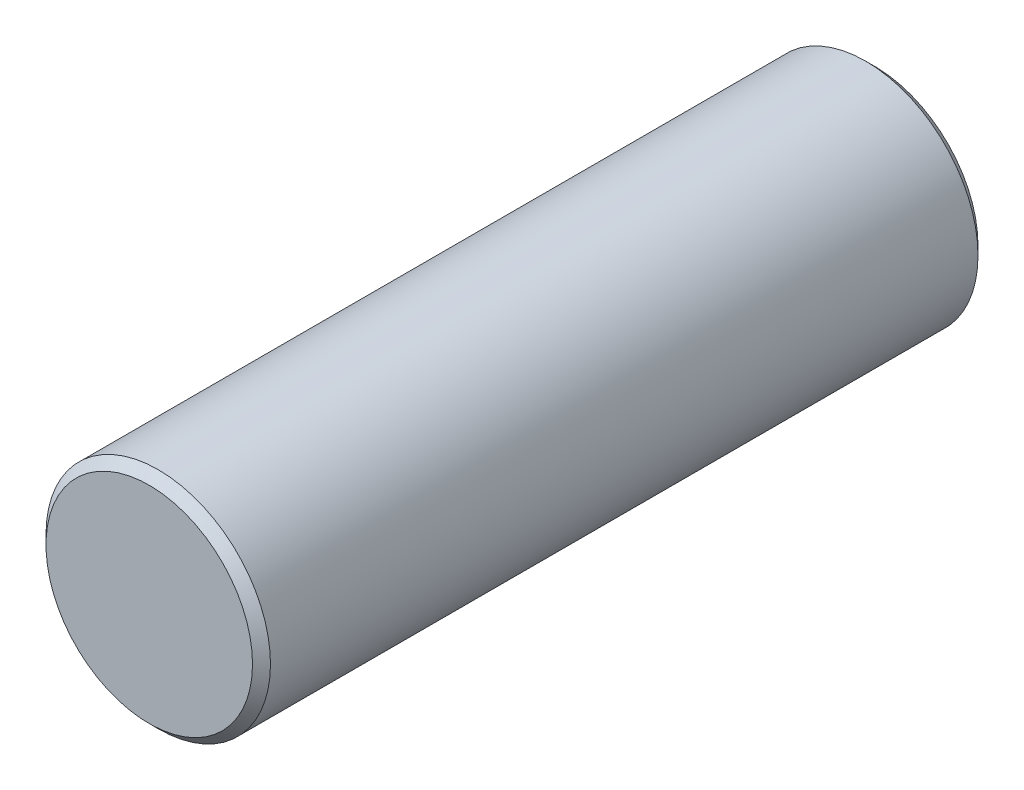
ISO-10303-21;
HEADER;
FILE_DESCRIPTION(('STEP AP214'),'2;1');
FILE_NAME('part.step','',(''),(''),'','','');
FILE_SCHEMA(('AUTOMOTIVE_DESIGN { 1 0 10303 214 1 1 1 1 }'));
ENDSEC;
DATA;
#1=APPLICATION_CONTEXT('core data for automotive mechanical design processes');
#2=APPLICATION_PROTOCOL_DEFINITION('international standard','automotive_design',2000,#1);
#3=PRODUCT_CONTEXT('',#1,'mechanical');
#4=PRODUCT('Part','Part','',(#3));
#5=PRODUCT_RELATED_PRODUCT_CATEGORY('part','',(#4));
#6=PRODUCT_DEFINITION_FORMATION('','',#4);
#7=PRODUCT_DEFINITION_CONTEXT('part definition',#1,'design');
#8=PRODUCT_DEFINITION('design','',#6,#7);
#9=PRODUCT_DEFINITION_SHAPE('','',#8);
#10=(LENGTH_UNIT() NAMED_UNIT(*) SI_UNIT(.MILLI.,.METRE.));
#11=(NAMED_UNIT(*) PLANE_ANGLE_UNIT() SI_UNIT($,.RADIAN.));
#12=(NAMED_UNIT(*) SI_UNIT($,.STERADIAN.) SOLID_ANGLE_UNIT());
#13=UNCERTAINTY_MEASURE_WITH_UNIT(LENGTH_MEASURE(1.E-05),#10,'distance_accuracy_value','');
#14=(GEOMETRIC_REPRESENTATION_CONTEXT(3) GLOBAL_UNCERTAINTY_ASSIGNED_CONTEXT((#13)) GLOBAL_UNIT_ASSIGNED_CONTEXT((#10,
#11,#12)) REPRESENTATION_CONTEXT('',''));
#15=CARTESIAN_POINT('',(0.,0.,0.));
#16=DIRECTION('',(0.,0.,1.));
#17=DIRECTION('',(1.,0.,0.));
#18=AXIS2_PLACEMENT_3D('',#15,#16,#17);
#19=CARTESIAN_POINT('',(0.,0.,8.08));
#20=DIRECTION('',(0.,0.,-1.));
#21=DIRECTION('',(-1.,0.,0.));
#22=AXIS2_PLACEMENT_3D('',#19,#20,#21);
#23=CYLINDRICAL_SURFACE('',#22,2.5);
#24=CARTESIAN_POINT('',(0.,0.,-7.87999999999999));
#25=DIRECTION('',(0.,0.,1.));
#26=DIRECTION('',(1.,0.,0.));
#27=AXIS2_PLACEMENT_3D('',#24,#25,#26);
#28=CIRCLE('',#27,2.5);
#29=CARTESIAN_POINT('',(2.5,0.,-7.87999999999999));
#30=VERTEX_POINT('',#29);
#31=EDGE_CURVE('E49',#30,#30,#28,.T.);
#32=ORIENTED_EDGE('',*,*,#31,.T.);
#33=EDGE_LOOP('',(#32));
#34=FACE_BOUND('',#33,.T.);
#35=CARTESIAN_POINT('',(0.,0.,7.88));
#36=DIRECTION('',(0.,0.,1.));
#37=DIRECTION('',(1.,0.,0.));
#38=AXIS2_PLACEMENT_3D('',#35,#36,#37);
#39=CIRCLE('',#38,2.5);
#40=CARTESIAN_POINT('',(2.5,0.,7.88));
#41=VERTEX_POINT('',#40);
#42=EDGE_CURVE('E53',#41,#41,#39,.F.);
#43=ORIENTED_EDGE('',*,*,#42,.T.);
#44=EDGE_LOOP('',(#43));
#45=FACE_BOUND('',#44,.T.);
#46=ADVANCED_FACE('F37',(#34,#45),#23,.T.);
#47=CARTESIAN_POINT('',(0.,0.,8.08));
#48=DIRECTION('',(0.,0.,1.));
#49=DIRECTION('',(1.,0.,0.));
#50=AXIS2_PLACEMENT_3D('',#47,#48,#49);
#51=PLANE('',#50);
#52=CARTESIAN_POINT('',(0.,0.,8.08));
#53=DIRECTION('',(0.,0.,1.));
#54=DIRECTION('',(1.,0.,0.));
#55=AXIS2_PLACEMENT_3D('',#52,#53,#54);
#56=CIRCLE('',#55,2.3);
#57=CARTESIAN_POINT('',(2.3,0.,8.08));
#58=VERTEX_POINT('',#57);
#59=EDGE_CURVE('E10',#58,#58,#56,.T.);
#60=ORIENTED_EDGE('',*,*,#59,.T.);
#61=EDGE_LOOP('',(#60));
#62=FACE_BOUND('',#61,.T.);
#63=ADVANCED_FACE('F69',(#62),#51,.T.);
#64=CARTESIAN_POINT('',(0.,0.,-8.08));
#65=DIRECTION('',(0.,0.,1.));
#66=DIRECTION('',(1.,0.,0.));
#67=AXIS2_PLACEMENT_3D('',#64,#65,#66);
#68=PLANE('',#67);
#69=CARTESIAN_POINT('',(0.,0.,-8.08));
#70=DIRECTION('',(0.,0.,1.));
#71=DIRECTION('',(1.,0.,0.));
#72=AXIS2_PLACEMENT_3D('',#69,#70,#71);
#73=CIRCLE('',#72,2.3);
#74=CARTESIAN_POINT('',(2.3,0.,-8.08));
#75=VERTEX_POINT('',#74);
#76=EDGE_CURVE('E45',#75,#75,#73,.F.);
#77=ORIENTED_EDGE('',*,*,#76,.T.);
#78=EDGE_LOOP('',(#77));
#79=FACE_BOUND('',#78,.T.);
#80=ADVANCED_FACE('F66',(#79),#68,.F.);
#81=CARTESIAN_POINT('',(0.,0.,-7.87999999999999));
#82=DIRECTION('',(0.,0.,1.));
#83=DIRECTION('',(1.,0.,0.));
#84=AXIS2_PLACEMENT_3D('',#81,#82,#83);
#85=CONICAL_SURFACE('',#84,2.5,0.785398163397444);
#86=ORIENTED_EDGE('',*,*,#76,.F.);
#87=EDGE_LOOP('',(#86));
#88=FACE_BOUND('',#87,.T.);
#89=ORIENTED_EDGE('',*,*,#31,.F.);
#90=EDGE_LOOP('',(#89));
#91=FACE_BOUND('',#90,.T.);
#92=ADVANCED_FACE('F62',(#88,#91),#85,.T.);
#93=CARTESIAN_POINT('',(0.,0.,8.08));
#94=DIRECTION('',(0.,0.,-1.));
#95=DIRECTION('',(-1.,0.,0.));
#96=AXIS2_PLACEMENT_3D('',#93,#94,#95);
#97=CONICAL_SURFACE('',#96,2.3,0.785398163397444);
#98=ORIENTED_EDGE('',*,*,#42,.F.);
#99=EDGE_LOOP('',(#98));
#100=FACE_BOUND('',#99,.T.);
#101=ORIENTED_EDGE('',*,*,#59,.F.);
#102=EDGE_LOOP('',(#101));
#103=FACE_BOUND('',#102,.T.);
#104=ADVANCED_FACE('F40',(#100,#103),#97,.T.);
#105=CLOSED_SHELL('',(#46,#63,#80,#92,#104));
#106=MANIFOLD_SOLID_BREP('B2',#105);
#107=ADVANCED_BREP_SHAPE_REPRESENTATION('',(#18,#106),#14);
#108=SHAPE_DEFINITION_REPRESENTATION(#9,#107);
ENDSEC;
END-ISO-10303-21;
